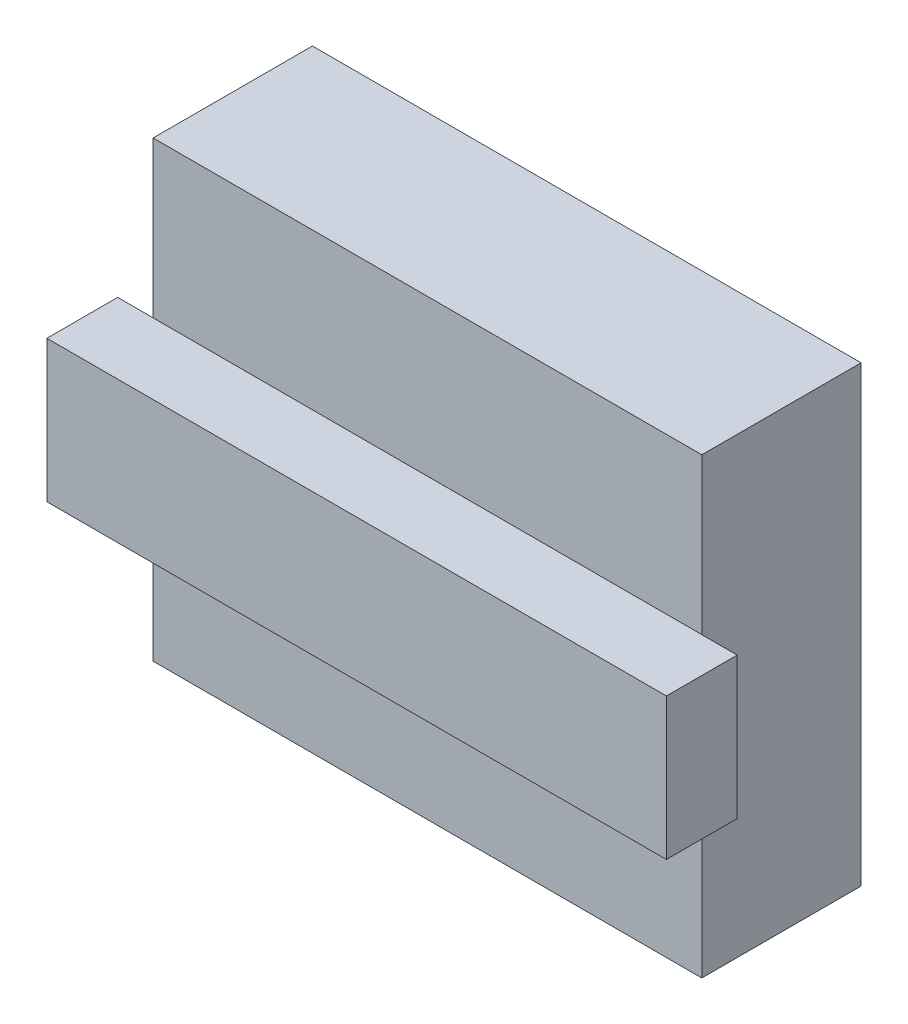
ISO-10303-21;
HEADER;
FILE_DESCRIPTION(('STEP AP214'),'2;1');
FILE_NAME('part.step','',(''),(''),'','','');
FILE_SCHEMA(('AUTOMOTIVE_DESIGN { 1 0 10303 214 1 1 1 1 }'));
ENDSEC;
DATA;
#1=APPLICATION_CONTEXT('core data for automotive mechanical design processes');
#2=APPLICATION_PROTOCOL_DEFINITION('international standard','automotive_design',2000,#1);
#3=PRODUCT_CONTEXT('',#1,'mechanical');
#4=PRODUCT('Part','Part','',(#3));
#5=PRODUCT_RELATED_PRODUCT_CATEGORY('part','',(#4));
#6=PRODUCT_DEFINITION_FORMATION('','',#4);
#7=PRODUCT_DEFINITION_CONTEXT('part definition',#1,'design');
#8=PRODUCT_DEFINITION('design','',#6,#7);
#9=PRODUCT_DEFINITION_SHAPE('','',#8);
#10=(LENGTH_UNIT() NAMED_UNIT(*) SI_UNIT(.MILLI.,.METRE.));
#11=(NAMED_UNIT(*) PLANE_ANGLE_UNIT() SI_UNIT($,.RADIAN.));
#12=(NAMED_UNIT(*) SI_UNIT($,.STERADIAN.) SOLID_ANGLE_UNIT());
#13=UNCERTAINTY_MEASURE_WITH_UNIT(LENGTH_MEASURE(1.E-05),#10,'distance_accuracy_value','');
#14=(GEOMETRIC_REPRESENTATION_CONTEXT(3) GLOBAL_UNCERTAINTY_ASSIGNED_CONTEXT((#13)) GLOBAL_UNIT_ASSIGNED_CONTEXT((#10,
#11,#12)) REPRESENTATION_CONTEXT('',''));
#15=CARTESIAN_POINT('',(0.,0.,0.));
#16=DIRECTION('',(0.,0.,1.));
#17=DIRECTION('',(1.,0.,0.));
#18=AXIS2_PLACEMENT_3D('',#15,#16,#17);
#19=CARTESIAN_POINT('',(0.,0.,4.5));
#20=DIRECTION('',(0.,0.,-1.));
#21=DIRECTION('',(-1.,0.,0.));
#22=AXIS2_PLACEMENT_3D('',#19,#20,#21);
#23=PLANE('',#22);
#24=DIRECTION('',(-1.,0.,0.));
#25=VECTOR('',#24,1.);
#26=CARTESIAN_POINT('',(7.75,2.,4.5));
#27=LINE('',#26,#25);
#28=CARTESIAN_POINT('',(7.75,2.,4.5));
#29=VERTEX_POINT('',#28);
#30=CARTESIAN_POINT('',(-7.75,2.,4.5));
#31=VERTEX_POINT('',#30);
#32=EDGE_CURVE('E11',#29,#31,#27,.T.);
#33=ORIENTED_EDGE('',*,*,#32,.F.);
#34=DIRECTION('',(0.,1.,0.));
#35=VECTOR('',#34,1.);
#36=CARTESIAN_POINT('',(7.75,-6.4,4.5));
#37=LINE('',#36,#35);
#38=CARTESIAN_POINT('',(7.75,6.4,4.5));
#39=VERTEX_POINT('',#38);
#40=EDGE_CURVE('E170',#29,#39,#37,.T.);
#41=ORIENTED_EDGE('',*,*,#40,.T.);
#42=DIRECTION('',(-1.,0.,0.));
#43=VECTOR('',#42,1.);
#44=CARTESIAN_POINT('',(-7.75,6.4,4.5));
#45=LINE('',#44,#43);
#46=CARTESIAN_POINT('',(-7.75,6.4,4.5));
#47=VERTEX_POINT('',#46);
#48=EDGE_CURVE('E168',#39,#47,#45,.T.);
#49=ORIENTED_EDGE('',*,*,#48,.T.);
#50=DIRECTION('',(0.,-1.,0.));
#51=VECTOR('',#50,1.);
#52=CARTESIAN_POINT('',(-7.75,-6.4,4.5));
#53=LINE('',#52,#51);
#54=EDGE_CURVE('E173',#47,#31,#53,.T.);
#55=ORIENTED_EDGE('',*,*,#54,.T.);
#56=EDGE_LOOP('',(#33,#41,#49,#55));
#57=FACE_BOUND('',#56,.T.);
#58=ADVANCED_FACE('F35',(#57),#23,.F.);
#59=DIRECTION('',(1.,0.,0.));
#60=VECTOR('',#59,1.);
#61=CARTESIAN_POINT('',(8.75,-2.,4.5));
#62=LINE('',#61,#60);
#63=CARTESIAN_POINT('',(-7.75,-2.,4.5));
#64=VERTEX_POINT('',#63);
#65=CARTESIAN_POINT('',(7.75,-2.,4.5));
#66=VERTEX_POINT('',#65);
#67=EDGE_CURVE('E44',#64,#66,#62,.T.);
#68=ORIENTED_EDGE('',*,*,#67,.F.);
#69=CARTESIAN_POINT('',(-7.75,-6.4,4.5));
#70=VERTEX_POINT('',#69);
#71=EDGE_CURVE('E172',#64,#70,#53,.T.);
#72=ORIENTED_EDGE('',*,*,#71,.T.);
#73=DIRECTION('',(1.,0.,0.));
#74=VECTOR('',#73,1.);
#75=CARTESIAN_POINT('',(-7.75,-6.4,4.5));
#76=LINE('',#75,#74);
#77=CARTESIAN_POINT('',(7.75,-6.4,4.5));
#78=VERTEX_POINT('',#77);
#79=EDGE_CURVE('E175',#70,#78,#76,.T.);
#80=ORIENTED_EDGE('',*,*,#79,.T.);
#81=EDGE_CURVE('E166',#78,#66,#37,.T.);
#82=ORIENTED_EDGE('',*,*,#81,.T.);
#83=EDGE_LOOP('',(#68,#72,#80,#82));
#84=FACE_BOUND('',#83,.T.);
#85=ADVANCED_FACE('F232',(#84),#23,.F.);
#86=CARTESIAN_POINT('',(7.75,-6.4,4.5));
#87=DIRECTION('',(-1.,0.,0.));
#88=DIRECTION('',(0.,0.,1.));
#89=AXIS2_PLACEMENT_3D('',#86,#87,#88);
#90=PLANE('',#89);
#91=DIRECTION('',(0.,1.,0.));
#92=VECTOR('',#91,1.);
#93=CARTESIAN_POINT('',(7.75,-6.4,0.));
#94=LINE('',#93,#92);
#95=CARTESIAN_POINT('',(7.75,-6.4,0.));
#96=VERTEX_POINT('',#95);
#97=CARTESIAN_POINT('',(7.75,6.4,0.));
#98=VERTEX_POINT('',#97);
#99=EDGE_CURVE('E163',#96,#98,#94,.T.);
#100=ORIENTED_EDGE('',*,*,#99,.T.);
#101=DIRECTION('',(0.,0.,-1.));
#102=VECTOR('',#101,1.);
#103=CARTESIAN_POINT('',(7.75,6.4,4.5));
#104=LINE('',#103,#102);
#105=EDGE_CURVE('E39',#39,#98,#104,.T.);
#106=ORIENTED_EDGE('',*,*,#105,.F.);
#107=ORIENTED_EDGE('',*,*,#40,.F.);
#108=EDGE_CURVE('E169',#66,#29,#37,.T.);
#109=ORIENTED_EDGE('',*,*,#108,.F.);
#110=ORIENTED_EDGE('',*,*,#81,.F.);
#111=DIRECTION('',(0.,0.,-1.));
#112=VECTOR('',#111,1.);
#113=CARTESIAN_POINT('',(7.75,-6.4,4.5));
#114=LINE('',#113,#112);
#115=EDGE_CURVE('E177',#78,#96,#114,.T.);
#116=ORIENTED_EDGE('',*,*,#115,.T.);
#117=EDGE_LOOP('',(#100,#106,#107,#109,#110,#116));
#118=FACE_BOUND('',#117,.T.);
#119=ADVANCED_FACE('F37',(#118),#90,.F.);
#120=CARTESIAN_POINT('',(-7.75,6.4,4.5));
#121=DIRECTION('',(0.,-1.,0.));
#122=DIRECTION('',(0.,0.,-1.));
#123=AXIS2_PLACEMENT_3D('',#120,#121,#122);
#124=PLANE('',#123);
#125=DIRECTION('',(-1.,0.,0.));
#126=VECTOR('',#125,1.);
#127=CARTESIAN_POINT('',(-7.75,6.4,0.));
#128=LINE('',#127,#126);
#129=CARTESIAN_POINT('',(-7.75,6.4,0.));
#130=VERTEX_POINT('',#129);
#131=EDGE_CURVE('E180',#98,#130,#128,.T.);
#132=ORIENTED_EDGE('',*,*,#131,.T.);
#133=DIRECTION('',(0.,0.,-1.));
#134=VECTOR('',#133,1.);
#135=CARTESIAN_POINT('',(-7.75,6.4,4.5));
#136=LINE('',#135,#134);
#137=EDGE_CURVE('E190',#47,#130,#136,.T.);
#138=ORIENTED_EDGE('',*,*,#137,.F.);
#139=ORIENTED_EDGE('',*,*,#48,.F.);
#140=ORIENTED_EDGE('',*,*,#105,.T.);
#141=EDGE_LOOP('',(#132,#138,#139,#140));
#142=FACE_BOUND('',#141,.T.);
#143=ADVANCED_FACE('F219',(#142),#124,.F.);
#144=CARTESIAN_POINT('',(-7.75,-6.4,4.5));
#145=DIRECTION('',(1.,0.,0.));
#146=DIRECTION('',(0.,0.,-1.));
#147=AXIS2_PLACEMENT_3D('',#144,#145,#146);
#148=PLANE('',#147);
#149=DIRECTION('',(0.,-1.,0.));
#150=VECTOR('',#149,1.);
#151=CARTESIAN_POINT('',(-7.75,-6.4,0.));
#152=LINE('',#151,#150);
#153=CARTESIAN_POINT('',(-7.75,-6.4,0.));
#154=VERTEX_POINT('',#153);
#155=EDGE_CURVE('E182',#130,#154,#152,.T.);
#156=ORIENTED_EDGE('',*,*,#155,.T.);
#157=DIRECTION('',(0.,0.,-1.));
#158=VECTOR('',#157,1.);
#159=CARTESIAN_POINT('',(-7.75,-6.4,4.5));
#160=LINE('',#159,#158);
#161=EDGE_CURVE('E188',#70,#154,#160,.T.);
#162=ORIENTED_EDGE('',*,*,#161,.F.);
#163=ORIENTED_EDGE('',*,*,#71,.F.);
#164=EDGE_CURVE('E60',#31,#64,#53,.T.);
#165=ORIENTED_EDGE('',*,*,#164,.F.);
#166=ORIENTED_EDGE('',*,*,#54,.F.);
#167=ORIENTED_EDGE('',*,*,#137,.T.);
#168=EDGE_LOOP('',(#156,#162,#163,#165,#166,#167));
#169=FACE_BOUND('',#168,.T.);
#170=ADVANCED_FACE('F220',(#169),#148,.F.);
#171=CARTESIAN_POINT('',(-7.75,-6.4,4.5));
#172=DIRECTION('',(0.,1.,0.));
#173=DIRECTION('',(0.,0.,1.));
#174=AXIS2_PLACEMENT_3D('',#171,#172,#173);
#175=PLANE('',#174);
#176=DIRECTION('',(1.,0.,0.));
#177=VECTOR('',#176,1.);
#178=CARTESIAN_POINT('',(-7.75,-6.4,0.));
#179=LINE('',#178,#177);
#180=EDGE_CURVE('E184',#154,#96,#179,.T.);
#181=ORIENTED_EDGE('',*,*,#180,.T.);
#182=ORIENTED_EDGE('',*,*,#115,.F.);
#183=ORIENTED_EDGE('',*,*,#79,.F.);
#184=ORIENTED_EDGE('',*,*,#161,.T.);
#185=EDGE_LOOP('',(#181,#182,#183,#184));
#186=FACE_BOUND('',#185,.T.);
#187=ADVANCED_FACE('F223',(#186),#175,.F.);
#188=CARTESIAN_POINT('',(0.,0.,0.));
#189=DIRECTION('',(0.,0.,-1.));
#190=DIRECTION('',(-1.,0.,0.));
#191=AXIS2_PLACEMENT_3D('',#188,#189,#190);
#192=PLANE('',#191);
#193=CARTESIAN_POINT('',(0.,0.,0.));
#194=DIRECTION('',(0.,0.,-1.));
#195=DIRECTION('',(0.,1.,0.));
#196=AXIS2_PLACEMENT_3D('',#193,#194,#195);
#197=CIRCLE('',#196,1.);
#198=CARTESIAN_POINT('',(0.,1.,0.));
#199=VERTEX_POINT('',#198);
#200=EDGE_CURVE('E135',#199,#199,#197,.T.);
#201=ORIENTED_EDGE('',*,*,#200,.F.);
#202=EDGE_LOOP('',(#201));
#203=FACE_BOUND('',#202,.T.);
#204=ORIENTED_EDGE('',*,*,#99,.F.);
#205=ORIENTED_EDGE('',*,*,#180,.F.);
#206=ORIENTED_EDGE('',*,*,#155,.F.);
#207=ORIENTED_EDGE('',*,*,#131,.F.);
#208=EDGE_LOOP('',(#204,#205,#206,#207));
#209=FACE_BOUND('',#208,.T.);
#210=ADVANCED_FACE('F218',(#203,#209),#192,.T.);
#211=CARTESIAN_POINT('',(0.,0.,-4.));
#212=DIRECTION('',(0.,0.,1.));
#213=DIRECTION('',(0.,-1.,0.));
#214=AXIS2_PLACEMENT_3D('',#211,#212,#213);
#215=CYLINDRICAL_SURFACE('',#214,1.);
#216=CARTESIAN_POINT('',(0.,0.,-4.));
#217=DIRECTION('',(0.,0.,-1.));
#218=DIRECTION('',(0.,1.,0.));
#219=AXIS2_PLACEMENT_3D('',#216,#217,#218);
#220=CIRCLE('',#219,1.);
#221=CARTESIAN_POINT('',(0.,1.,-4.));
#222=VERTEX_POINT('',#221);
#223=EDGE_CURVE('E160',#222,#222,#220,.T.);
#224=ORIENTED_EDGE('',*,*,#223,.F.);
#225=EDGE_LOOP('',(#224));
#226=FACE_BOUND('',#225,.T.);
#227=ORIENTED_EDGE('',*,*,#200,.T.);
#228=EDGE_LOOP('',(#227));
#229=FACE_BOUND('',#228,.T.);
#230=ADVANCED_FACE('F239',(#226,#229),#215,.T.);
#231=CARTESIAN_POINT('',(0.,0.,-4.));
#232=DIRECTION('',(0.,0.,-1.));
#233=DIRECTION('',(0.,1.,0.));
#234=AXIS2_PLACEMENT_3D('',#231,#232,#233);
#235=PLANE('',#234);
#236=ORIENTED_EDGE('',*,*,#223,.T.);
#237=EDGE_LOOP('',(#236));
#238=FACE_BOUND('',#237,.T.);
#239=ADVANCED_FACE('F246',(#238),#235,.T.);
#240=CARTESIAN_POINT('',(0.,0.,4.5));
#241=DIRECTION('',(0.,0.,-1.));
#242=DIRECTION('',(-1.,0.,0.));
#243=AXIS2_PLACEMENT_3D('',#240,#241,#242);
#244=PLANE('',#243);
#245=CARTESIAN_POINT('',(8.75,-2.,4.5));
#246=VERTEX_POINT('',#245);
#247=EDGE_CURVE('E149',#66,#246,#62,.T.);
#248=ORIENTED_EDGE('',*,*,#247,.F.);
#249=ORIENTED_EDGE('',*,*,#108,.T.);
#250=CARTESIAN_POINT('',(8.75,2.,4.5));
#251=VERTEX_POINT('',#250);
#252=EDGE_CURVE('E46',#251,#29,#27,.T.);
#253=ORIENTED_EDGE('',*,*,#252,.F.);
#254=DIRECTION('',(0.,1.,0.));
#255=VECTOR('',#254,1.);
#256=CARTESIAN_POINT('',(8.75,2.,4.5));
#257=LINE('',#256,#255);
#258=EDGE_CURVE('E153',#246,#251,#257,.T.);
#259=ORIENTED_EDGE('',*,*,#258,.F.);
#260=EDGE_LOOP('',(#248,#249,#253,#259));
#261=FACE_BOUND('',#260,.T.);
#262=ADVANCED_FACE('F208',(#261),#244,.T.);
#263=CARTESIAN_POINT('',(-8.75,2.,6.5));
#264=DIRECTION('',(1.,0.,0.));
#265=DIRECTION('',(0.,1.,0.));
#266=AXIS2_PLACEMENT_3D('',#263,#264,#265);
#267=PLANE('',#266);
#268=DIRECTION('',(0.,-1.,0.));
#269=VECTOR('',#268,1.);
#270=CARTESIAN_POINT('',(-8.75,2.,4.5));
#271=LINE('',#270,#269);
#272=CARTESIAN_POINT('',(-8.75,2.,4.5));
#273=VERTEX_POINT('',#272);
#274=CARTESIAN_POINT('',(-8.75,-2.,4.5));
#275=VERTEX_POINT('',#274);
#276=EDGE_CURVE('E147',#273,#275,#271,.T.);
#277=ORIENTED_EDGE('',*,*,#276,.T.);
#278=DIRECTION('',(0.,0.,-1.));
#279=VECTOR('',#278,1.);
#280=CARTESIAN_POINT('',(-8.75,-2.,6.5));
#281=LINE('',#280,#279);
#282=CARTESIAN_POINT('',(-8.75,-2.,6.5));
#283=VERTEX_POINT('',#282);
#284=EDGE_CURVE('E136',#283,#275,#281,.T.);
#285=ORIENTED_EDGE('',*,*,#284,.F.);
#286=DIRECTION('',(0.,-1.,0.));
#287=VECTOR('',#286,1.);
#288=CARTESIAN_POINT('',(-8.75,2.,6.5));
#289=LINE('',#288,#287);
#290=CARTESIAN_POINT('',(-8.75,2.,6.5));
#291=VERTEX_POINT('',#290);
#292=EDGE_CURVE('E119',#291,#283,#289,.T.);
#293=ORIENTED_EDGE('',*,*,#292,.F.);
#294=DIRECTION('',(0.,0.,-1.));
#295=VECTOR('',#294,1.);
#296=CARTESIAN_POINT('',(-8.75,2.,6.5));
#297=LINE('',#296,#295);
#298=EDGE_CURVE('E128',#291,#273,#297,.T.);
#299=ORIENTED_EDGE('',*,*,#298,.T.);
#300=EDGE_LOOP('',(#277,#285,#293,#299));
#301=FACE_BOUND('',#300,.T.);
#302=ADVANCED_FACE('F138',(#301),#267,.F.);
#303=CARTESIAN_POINT('',(8.75,-2.,6.5));
#304=DIRECTION('',(0.,1.,0.));
#305=DIRECTION('',(-1.,0.,0.));
#306=AXIS2_PLACEMENT_3D('',#303,#304,#305);
#307=PLANE('',#306);
#308=EDGE_CURVE('E150',#275,#64,#62,.T.);
#309=ORIENTED_EDGE('',*,*,#308,.T.);
#310=ORIENTED_EDGE('',*,*,#67,.T.);
#311=ORIENTED_EDGE('',*,*,#247,.T.);
#312=DIRECTION('',(0.,0.,-1.));
#313=VECTOR('',#312,1.);
#314=CARTESIAN_POINT('',(8.75,-2.,6.5));
#315=LINE('',#314,#313);
#316=CARTESIAN_POINT('',(8.75,-2.,6.5));
#317=VERTEX_POINT('',#316);
#318=EDGE_CURVE('E156',#317,#246,#315,.T.);
#319=ORIENTED_EDGE('',*,*,#318,.F.);
#320=DIRECTION('',(1.,0.,0.));
#321=VECTOR('',#320,1.);
#322=CARTESIAN_POINT('',(-8.75,-2.,6.5));
#323=LINE('',#322,#321);
#324=EDGE_CURVE('E141',#283,#317,#323,.T.);
#325=ORIENTED_EDGE('',*,*,#324,.F.);
#326=ORIENTED_EDGE('',*,*,#284,.T.);
#327=EDGE_LOOP('',(#309,#310,#311,#319,#325,#326));
#328=FACE_BOUND('',#327,.T.);
#329=ADVANCED_FACE('F201',(#328),#307,.F.);
#330=CARTESIAN_POINT('',(8.75,2.,6.5));
#331=DIRECTION('',(-1.,0.,0.));
#332=DIRECTION('',(0.,-1.,0.));
#333=AXIS2_PLACEMENT_3D('',#330,#331,#332);
#334=PLANE('',#333);
#335=ORIENTED_EDGE('',*,*,#258,.T.);
#336=DIRECTION('',(0.,0.,-1.));
#337=VECTOR('',#336,1.);
#338=CARTESIAN_POINT('',(8.75,2.,6.5));
#339=LINE('',#338,#337);
#340=CARTESIAN_POINT('',(8.75,2.,6.5));
#341=VERTEX_POINT('',#340);
#342=EDGE_CURVE('E146',#341,#251,#339,.T.);
#343=ORIENTED_EDGE('',*,*,#342,.F.);
#344=DIRECTION('',(0.,1.,0.));
#345=VECTOR('',#344,1.);
#346=CARTESIAN_POINT('',(8.75,2.,6.5));
#347=LINE('',#346,#345);
#348=EDGE_CURVE('E122',#317,#341,#347,.T.);
#349=ORIENTED_EDGE('',*,*,#348,.F.);
#350=ORIENTED_EDGE('',*,*,#318,.T.);
#351=EDGE_LOOP('',(#335,#343,#349,#350));
#352=FACE_BOUND('',#351,.T.);
#353=ADVANCED_FACE('F206',(#352),#334,.F.);
#354=CARTESIAN_POINT('',(7.75,2.,6.5));
#355=DIRECTION('',(0.,-1.,0.));
#356=DIRECTION('',(1.,0.,0.));
#357=AXIS2_PLACEMENT_3D('',#354,#355,#356);
#358=PLANE('',#357);
#359=ORIENTED_EDGE('',*,*,#252,.T.);
#360=ORIENTED_EDGE('',*,*,#32,.T.);
#361=EDGE_CURVE('E47',#31,#273,#27,.T.);
#362=ORIENTED_EDGE('',*,*,#361,.T.);
#363=ORIENTED_EDGE('',*,*,#298,.F.);
#364=DIRECTION('',(-1.,0.,0.));
#365=VECTOR('',#364,1.);
#366=CARTESIAN_POINT('',(-7.75,2.,6.5));
#367=LINE('',#366,#365);
#368=EDGE_CURVE('E115',#341,#291,#367,.T.);
#369=ORIENTED_EDGE('',*,*,#368,.F.);
#370=ORIENTED_EDGE('',*,*,#342,.T.);
#371=EDGE_LOOP('',(#359,#360,#362,#363,#369,#370));
#372=FACE_BOUND('',#371,.T.);
#373=ADVANCED_FACE('F130',(#372),#358,.F.);
#374=CARTESIAN_POINT('',(0.,0.,6.5));
#375=DIRECTION('',(0.,0.,-1.));
#376=DIRECTION('',(-1.,0.,0.));
#377=AXIS2_PLACEMENT_3D('',#374,#375,#376);
#378=PLANE('',#377);
#379=ORIENTED_EDGE('',*,*,#368,.T.);
#380=ORIENTED_EDGE('',*,*,#292,.T.);
#381=ORIENTED_EDGE('',*,*,#324,.T.);
#382=ORIENTED_EDGE('',*,*,#348,.T.);
#383=EDGE_LOOP('',(#379,#380,#381,#382));
#384=FACE_BOUND('',#383,.T.);
#385=ADVANCED_FACE('F117',(#384),#378,.F.);
#386=ORIENTED_EDGE('',*,*,#361,.F.);
#387=ORIENTED_EDGE('',*,*,#164,.T.);
#388=ORIENTED_EDGE('',*,*,#308,.F.);
#389=ORIENTED_EDGE('',*,*,#276,.F.);
#390=EDGE_LOOP('',(#386,#387,#388,#389));
#391=FACE_BOUND('',#390,.T.);
#392=ADVANCED_FACE('F259',(#391),#244,.T.);
#393=CLOSED_SHELL('',(#58,#85,#119,#143,#170,#187,#210,#230,#239,#262,#302,#329,#353,#373,#385,#392));
#394=MANIFOLD_SOLID_BREP('B2',#393);
#395=ADVANCED_BREP_SHAPE_REPRESENTATION('',(#18,#394),#14);
#396=SHAPE_DEFINITION_REPRESENTATION(#9,#395);
ENDSEC;
END-ISO-10303-21;
